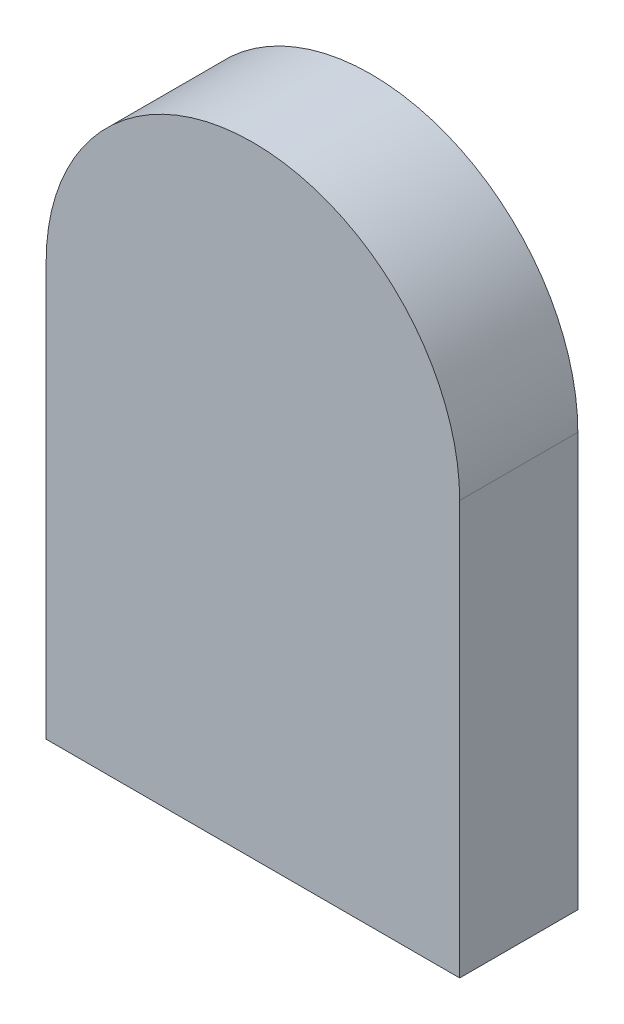
ISO-10303-21;
HEADER;
FILE_DESCRIPTION(('STEP AP214'),'2;1');
FILE_NAME('part.step','',(''),(''),'','','');
FILE_SCHEMA(('AUTOMOTIVE_DESIGN { 1 0 10303 214 1 1 1 1 }'));
ENDSEC;
DATA;
#1=APPLICATION_CONTEXT('core data for automotive mechanical design processes');
#2=APPLICATION_PROTOCOL_DEFINITION('international standard','automotive_design',2000,#1);
#3=PRODUCT_CONTEXT('',#1,'mechanical');
#4=PRODUCT('Part','Part','',(#3));
#5=PRODUCT_RELATED_PRODUCT_CATEGORY('part','',(#4));
#6=PRODUCT_DEFINITION_FORMATION('','',#4);
#7=PRODUCT_DEFINITION_CONTEXT('part definition',#1,'design');
#8=PRODUCT_DEFINITION('design','',#6,#7);
#9=PRODUCT_DEFINITION_SHAPE('','',#8);
#10=(LENGTH_UNIT() NAMED_UNIT(*) SI_UNIT(.MILLI.,.METRE.));
#11=(NAMED_UNIT(*) PLANE_ANGLE_UNIT() SI_UNIT($,.RADIAN.));
#12=(NAMED_UNIT(*) SI_UNIT($,.STERADIAN.) SOLID_ANGLE_UNIT());
#13=UNCERTAINTY_MEASURE_WITH_UNIT(LENGTH_MEASURE(1.E-05),#10,'distance_accuracy_value','');
#14=(GEOMETRIC_REPRESENTATION_CONTEXT(3) GLOBAL_UNCERTAINTY_ASSIGNED_CONTEXT((#13)) GLOBAL_UNIT_ASSIGNED_CONTEXT((#10,
#11,#12)) REPRESENTATION_CONTEXT('',''));
#15=CARTESIAN_POINT('',(0.,0.,0.));
#16=DIRECTION('',(0.,0.,1.));
#17=DIRECTION('',(1.,0.,0.));
#18=AXIS2_PLACEMENT_3D('',#15,#16,#17);
#19=CARTESIAN_POINT('',(0.,35.,10.));
#20=DIRECTION('',(1.,0.,0.));
#21=DIRECTION('',(0.,0.,-1.));
#22=AXIS2_PLACEMENT_3D('',#19,#20,#21);
#23=PLANE('',#22);
#24=DIRECTION('',(0.,-1.,0.));
#25=VECTOR('',#24,1.);
#26=CARTESIAN_POINT('',(0.,35.,0.));
#27=LINE('',#26,#25);
#28=CARTESIAN_POINT('',(0.,35.,0.));
#29=VERTEX_POINT('',#28);
#30=CARTESIAN_POINT('',(0.,0.,0.));
#31=VERTEX_POINT('',#30);
#32=EDGE_CURVE('E134',#29,#31,#27,.T.);
#33=ORIENTED_EDGE('',*,*,#32,.T.);
#34=DIRECTION('',(0.,0.,-1.));
#35=VECTOR('',#34,1.);
#36=CARTESIAN_POINT('',(0.,0.,10.));
#37=LINE('',#36,#35);
#38=CARTESIAN_POINT('',(0.,0.,10.));
#39=VERTEX_POINT('',#38);
#40=EDGE_CURVE('E12',#39,#31,#37,.T.);
#41=ORIENTED_EDGE('',*,*,#40,.F.);
#42=DIRECTION('',(0.,-1.,0.));
#43=VECTOR('',#42,1.);
#44=CARTESIAN_POINT('',(0.,35.,10.));
#45=LINE('',#44,#43);
#46=CARTESIAN_POINT('',(0.,35.,10.));
#47=VERTEX_POINT('',#46);
#48=EDGE_CURVE('E98',#47,#39,#45,.T.);
#49=ORIENTED_EDGE('',*,*,#48,.F.);
#50=DIRECTION('',(0.,0.,-1.));
#51=VECTOR('',#50,1.);
#52=CARTESIAN_POINT('',(0.,35.,10.));
#53=LINE('',#52,#51);
#54=EDGE_CURVE('E110',#47,#29,#53,.T.);
#55=ORIENTED_EDGE('',*,*,#54,.T.);
#56=EDGE_LOOP('',(#33,#41,#49,#55));
#57=FACE_BOUND('',#56,.T.);
#58=ADVANCED_FACE('F46',(#57),#23,.F.);
#59=CARTESIAN_POINT('',(0.,0.,10.));
#60=DIRECTION('',(0.,1.,0.));
#61=DIRECTION('',(0.,0.,1.));
#62=AXIS2_PLACEMENT_3D('',#59,#60,#61);
#63=PLANE('',#62);
#64=DIRECTION('',(1.,0.,0.));
#65=VECTOR('',#64,1.);
#66=CARTESIAN_POINT('',(0.,0.,0.));
#67=LINE('',#66,#65);
#68=CARTESIAN_POINT('',(35.,0.,0.));
#69=VERTEX_POINT('',#68);
#70=EDGE_CURVE('E103',#31,#69,#67,.T.);
#71=ORIENTED_EDGE('',*,*,#70,.T.);
#72=DIRECTION('',(0.,0.,-1.));
#73=VECTOR('',#72,1.);
#74=CARTESIAN_POINT('',(35.,0.,10.));
#75=LINE('',#74,#73);
#76=CARTESIAN_POINT('',(35.,0.,10.));
#77=VERTEX_POINT('',#76);
#78=EDGE_CURVE('E55',#77,#69,#75,.T.);
#79=ORIENTED_EDGE('',*,*,#78,.F.);
#80=DIRECTION('',(1.,0.,0.));
#81=VECTOR('',#80,1.);
#82=CARTESIAN_POINT('',(0.,0.,10.));
#83=LINE('',#82,#81);
#84=EDGE_CURVE('E93',#39,#77,#83,.T.);
#85=ORIENTED_EDGE('',*,*,#84,.F.);
#86=ORIENTED_EDGE('',*,*,#40,.T.);
#87=EDGE_LOOP('',(#71,#79,#85,#86));
#88=FACE_BOUND('',#87,.T.);
#89=ADVANCED_FACE('F102',(#88),#63,.F.);
#90=CARTESIAN_POINT('',(35.,0.,10.));
#91=DIRECTION('',(-1.,0.,0.));
#92=DIRECTION('',(0.,0.,1.));
#93=AXIS2_PLACEMENT_3D('',#90,#91,#92);
#94=PLANE('',#93);
#95=DIRECTION('',(0.,1.,0.));
#96=VECTOR('',#95,1.);
#97=CARTESIAN_POINT('',(35.,0.,0.));
#98=LINE('',#97,#96);
#99=CARTESIAN_POINT('',(35.,35.,0.));
#100=VERTEX_POINT('',#99);
#101=EDGE_CURVE('E80',#69,#100,#98,.T.);
#102=ORIENTED_EDGE('',*,*,#101,.T.);
#103=DIRECTION('',(0.,0.,-1.));
#104=VECTOR('',#103,1.);
#105=CARTESIAN_POINT('',(35.,35.,10.));
#106=LINE('',#105,#104);
#107=CARTESIAN_POINT('',(35.,35.,10.));
#108=VERTEX_POINT('',#107);
#109=EDGE_CURVE('E105',#108,#100,#106,.T.);
#110=ORIENTED_EDGE('',*,*,#109,.F.);
#111=DIRECTION('',(0.,1.,0.));
#112=VECTOR('',#111,1.);
#113=CARTESIAN_POINT('',(35.,0.,10.));
#114=LINE('',#113,#112);
#115=EDGE_CURVE('E96',#77,#108,#114,.T.);
#116=ORIENTED_EDGE('',*,*,#115,.F.);
#117=ORIENTED_EDGE('',*,*,#78,.T.);
#118=EDGE_LOOP('',(#102,#110,#116,#117));
#119=FACE_BOUND('',#118,.T.);
#120=ADVANCED_FACE('F106',(#119),#94,.F.);
#121=CARTESIAN_POINT('',(17.5,35.,10.));
#122=DIRECTION('',(0.,0.,-1.));
#123=DIRECTION('',(-1.,0.,0.));
#124=AXIS2_PLACEMENT_3D('',#121,#122,#123);
#125=CYLINDRICAL_SURFACE('',#124,17.5);
#126=CARTESIAN_POINT('',(17.5,35.,0.));
#127=DIRECTION('',(0.,0.,1.));
#128=DIRECTION('',(-1.,0.,0.));
#129=AXIS2_PLACEMENT_3D('',#126,#127,#128);
#130=CIRCLE('',#129,17.5);
#131=EDGE_CURVE('E86',#100,#29,#130,.T.);
#132=ORIENTED_EDGE('',*,*,#131,.T.);
#133=ORIENTED_EDGE('',*,*,#54,.F.);
#134=CARTESIAN_POINT('',(17.5,35.,10.));
#135=DIRECTION('',(0.,0.,1.));
#136=DIRECTION('',(-1.,0.,0.));
#137=AXIS2_PLACEMENT_3D('',#134,#135,#136);
#138=CIRCLE('',#137,17.5);
#139=EDGE_CURVE('E63',#108,#47,#138,.T.);
#140=ORIENTED_EDGE('',*,*,#139,.F.);
#141=ORIENTED_EDGE('',*,*,#109,.T.);
#142=EDGE_LOOP('',(#132,#133,#140,#141));
#143=FACE_BOUND('',#142,.T.);
#144=ADVANCED_FACE('F129',(#143),#125,.T.);
#145=CARTESIAN_POINT('',(17.5,35.,10.));
#146=DIRECTION('',(0.,0.,-1.));
#147=DIRECTION('',(-1.,0.,0.));
#148=AXIS2_PLACEMENT_3D('',#145,#146,#147);
#149=PLANE('',#148);
#150=ORIENTED_EDGE('',*,*,#48,.T.);
#151=ORIENTED_EDGE('',*,*,#84,.T.);
#152=ORIENTED_EDGE('',*,*,#115,.T.);
#153=ORIENTED_EDGE('',*,*,#139,.T.);
#154=EDGE_LOOP('',(#150,#151,#152,#153));
#155=FACE_BOUND('',#154,.T.);
#156=ADVANCED_FACE('F94',(#155),#149,.F.);
#157=CARTESIAN_POINT('',(17.5,35.,0.));
#158=DIRECTION('',(0.,0.,-1.));
#159=DIRECTION('',(-1.,0.,0.));
#160=AXIS2_PLACEMENT_3D('',#157,#158,#159);
#161=PLANE('',#160);
#162=ORIENTED_EDGE('',*,*,#32,.F.);
#163=ORIENTED_EDGE('',*,*,#131,.F.);
#164=ORIENTED_EDGE('',*,*,#101,.F.);
#165=ORIENTED_EDGE('',*,*,#70,.F.);
#166=EDGE_LOOP('',(#162,#163,#164,#165));
#167=FACE_BOUND('',#166,.T.);
#168=ADVANCED_FACE('F132',(#167),#161,.T.);
#169=CLOSED_SHELL('',(#58,#89,#120,#144,#156,#168));
#170=MANIFOLD_SOLID_BREP('B2',#169);
#171=ADVANCED_BREP_SHAPE_REPRESENTATION('',(#18,#170),#14);
#172=SHAPE_DEFINITION_REPRESENTATION(#9,#171);
ENDSEC;
END-ISO-10303-21;
